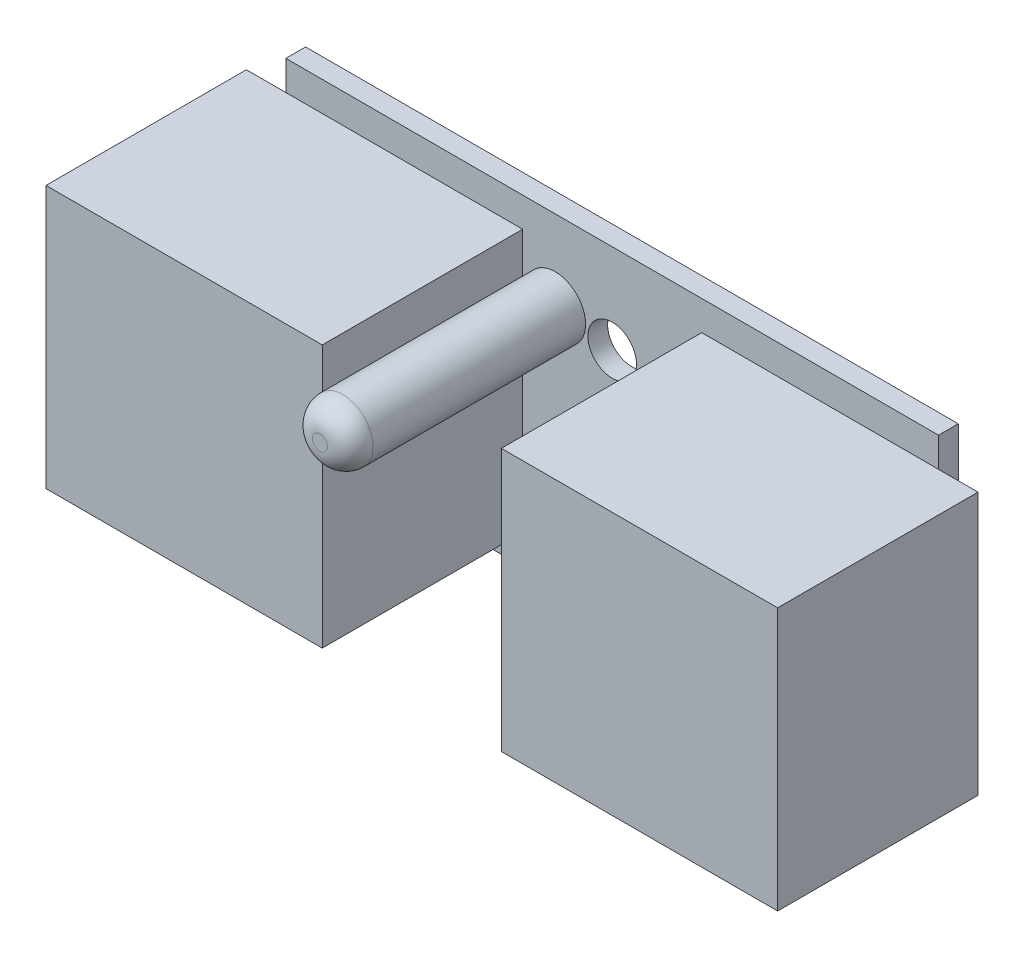
ISO-10303-21;
HEADER;
FILE_DESCRIPTION(('STEP AP214'),'2;1');
FILE_NAME('part.step','',(''),(''),'','','');
FILE_SCHEMA(('AUTOMOTIVE_DESIGN { 1 0 10303 214 1 1 1 1 }'));
ENDSEC;
DATA;
#1=APPLICATION_CONTEXT('core data for automotive mechanical design processes');
#2=APPLICATION_PROTOCOL_DEFINITION('international standard','automotive_design',2000,#1);
#3=PRODUCT_CONTEXT('',#1,'mechanical');
#4=PRODUCT('Part','Part','',(#3));
#5=PRODUCT_RELATED_PRODUCT_CATEGORY('part','',(#4));
#6=PRODUCT_DEFINITION_FORMATION('','',#4);
#7=PRODUCT_DEFINITION_CONTEXT('part definition',#1,'design');
#8=PRODUCT_DEFINITION('design','',#6,#7);
#9=PRODUCT_DEFINITION_SHAPE('','',#8);
#10=(LENGTH_UNIT() NAMED_UNIT(*) SI_UNIT(.MILLI.,.METRE.));
#11=(NAMED_UNIT(*) PLANE_ANGLE_UNIT() SI_UNIT($,.RADIAN.));
#12=(NAMED_UNIT(*) SI_UNIT($,.STERADIAN.) SOLID_ANGLE_UNIT());
#13=UNCERTAINTY_MEASURE_WITH_UNIT(LENGTH_MEASURE(1.E-05),#10,'distance_accuracy_value','');
#14=(GEOMETRIC_REPRESENTATION_CONTEXT(3) GLOBAL_UNCERTAINTY_ASSIGNED_CONTEXT((#13)) GLOBAL_UNIT_ASSIGNED_CONTEXT((#10,
#11,#12)) REPRESENTATION_CONTEXT('',''));
#15=CARTESIAN_POINT('',(0.,0.,0.));
#16=DIRECTION('',(0.,0.,1.));
#17=DIRECTION('',(1.,0.,0.));
#18=AXIS2_PLACEMENT_3D('',#15,#16,#17);
#19=CARTESIAN_POINT('',(0.,0.,1.3));
#20=DIRECTION('',(0.,0.,-1.));
#21=DIRECTION('',(-1.,0.,0.));
#22=AXIS2_PLACEMENT_3D('',#19,#20,#21);
#23=PLANE('',#22);
#24=CARTESIAN_POINT('',(17.75,15.9,1.3));
#25=DIRECTION('',(0.,0.,-1.));
#26=DIRECTION('',(-1.,0.,0.));
#27=AXIS2_PLACEMENT_3D('',#24,#25,#26);
#28=CIRCLE('',#27,2.);
#29=CARTESIAN_POINT('',(15.75,15.9,1.3));
#30=VERTEX_POINT('',#29);
#31=EDGE_CURVE('E251',#30,#30,#28,.F.);
#32=ORIENTED_EDGE('',*,*,#31,.F.);
#33=EDGE_LOOP('',(#32));
#34=FACE_BOUND('',#33,.T.);
#35=CARTESIAN_POINT('',(21.5,15.3,1.3));
#36=DIRECTION('',(0.,0.,1.));
#37=DIRECTION('',(1.,0.,0.));
#38=AXIS2_PLACEMENT_3D('',#35,#36,#37);
#39=CIRCLE('',#38,1.6);
#40=CARTESIAN_POINT('',(23.1,15.3,1.3));
#41=VERTEX_POINT('',#40);
#42=EDGE_CURVE('E212',#41,#41,#39,.T.);
#43=ORIENTED_EDGE('',*,*,#42,.F.);
#44=EDGE_LOOP('',(#43));
#45=FACE_BOUND('',#44,.T.);
#46=DIRECTION('',(1.,0.,0.));
#47=VECTOR('',#46,1.);
#48=CARTESIAN_POINT('',(-2.6,1.95,1.3));
#49=LINE('',#48,#47);
#50=CARTESIAN_POINT('',(0.,1.95,1.3));
#51=VERTEX_POINT('',#50);
#52=CARTESIAN_POINT('',(15.6,1.95,1.3));
#53=VERTEX_POINT('',#52);
#54=EDGE_CURVE('E314',#51,#53,#49,.T.);
#55=ORIENTED_EDGE('',*,*,#54,.F.);
#56=DIRECTION('',(0.,-1.,0.));
#57=VECTOR('',#56,1.);
#58=CARTESIAN_POINT('',(0.,0.,1.3));
#59=LINE('',#58,#57);
#60=CARTESIAN_POINT('',(0.,0.,1.3));
#61=VERTEX_POINT('',#60);
#62=EDGE_CURVE('E222',#51,#61,#59,.T.);
#63=ORIENTED_EDGE('',*,*,#62,.T.);
#64=DIRECTION('',(1.,0.,0.));
#65=VECTOR('',#64,1.);
#66=CARTESIAN_POINT('',(0.,0.,1.3));
#67=LINE('',#66,#65);
#68=CARTESIAN_POINT('',(43.,0.,1.3));
#69=VERTEX_POINT('',#68);
#70=EDGE_CURVE('E220',#61,#69,#67,.T.);
#71=ORIENTED_EDGE('',*,*,#70,.T.);
#72=DIRECTION('',(0.,1.,0.));
#73=VECTOR('',#72,1.);
#74=CARTESIAN_POINT('',(43.,0.,1.3));
#75=LINE('',#74,#73);
#76=CARTESIAN_POINT('',(43.,1.95,1.3));
#77=VERTEX_POINT('',#76);
#78=EDGE_CURVE('E225',#69,#77,#75,.T.);
#79=ORIENTED_EDGE('',*,*,#78,.T.);
#80=DIRECTION('',(1.,0.,0.));
#81=VECTOR('',#80,1.);
#82=CARTESIAN_POINT('',(45.6,1.95,1.3));
#83=LINE('',#82,#81);
#84=CARTESIAN_POINT('',(27.4,1.95,1.3));
#85=VERTEX_POINT('',#84);
#86=EDGE_CURVE('E184',#85,#77,#83,.T.);
#87=ORIENTED_EDGE('',*,*,#86,.F.);
#88=DIRECTION('',(0.,-1.,0.));
#89=VECTOR('',#88,1.);
#90=CARTESIAN_POINT('',(27.4,1.95,1.3));
#91=LINE('',#90,#89);
#92=CARTESIAN_POINT('',(27.4,19.25,1.3));
#93=VERTEX_POINT('',#92);
#94=EDGE_CURVE('E194',#93,#85,#91,.T.);
#95=ORIENTED_EDGE('',*,*,#94,.F.);
#96=DIRECTION('',(-1.,0.,0.));
#97=VECTOR('',#96,1.);
#98=CARTESIAN_POINT('',(45.6,19.25,1.3));
#99=LINE('',#98,#97);
#100=CARTESIAN_POINT('',(43.,19.25,1.3));
#101=VERTEX_POINT('',#100);
#102=EDGE_CURVE('E174',#101,#93,#99,.T.);
#103=ORIENTED_EDGE('',*,*,#102,.F.);
#104=CARTESIAN_POINT('',(43.,21.2,1.3));
#105=VERTEX_POINT('',#104);
#106=EDGE_CURVE('E224',#101,#105,#75,.T.);
#107=ORIENTED_EDGE('',*,*,#106,.T.);
#108=DIRECTION('',(-1.,0.,0.));
#109=VECTOR('',#108,1.);
#110=CARTESIAN_POINT('',(0.,21.2,1.3));
#111=LINE('',#110,#109);
#112=CARTESIAN_POINT('',(0.,21.2,1.3));
#113=VERTEX_POINT('',#112);
#114=EDGE_CURVE('E228',#105,#113,#111,.T.);
#115=ORIENTED_EDGE('',*,*,#114,.T.);
#116=CARTESIAN_POINT('',(0.,19.25,1.3));
#117=VERTEX_POINT('',#116);
#118=EDGE_CURVE('E218',#113,#117,#59,.T.);
#119=ORIENTED_EDGE('',*,*,#118,.T.);
#120=DIRECTION('',(-1.,0.,0.));
#121=VECTOR('',#120,1.);
#122=CARTESIAN_POINT('',(-2.6,19.25,1.3));
#123=LINE('',#122,#121);
#124=CARTESIAN_POINT('',(15.6,19.25,1.3));
#125=VERTEX_POINT('',#124);
#126=EDGE_CURVE('E65',#125,#117,#123,.T.);
#127=ORIENTED_EDGE('',*,*,#126,.F.);
#128=DIRECTION('',(0.,1.,0.));
#129=VECTOR('',#128,1.);
#130=CARTESIAN_POINT('',(15.6,19.25,1.3));
#131=LINE('',#130,#129);
#132=EDGE_CURVE('E60',#53,#125,#131,.T.);
#133=ORIENTED_EDGE('',*,*,#132,.F.);
#134=EDGE_LOOP('',(#55,#63,#71,#79,#87,#95,#103,#107,#115,#119,#127,#133));
#135=FACE_BOUND('',#134,.T.);
#136=ADVANCED_FACE('F45',(#34,#45,#135),#23,.F.);
#137=CARTESIAN_POINT('',(0.,0.,0.));
#138=DIRECTION('',(0.,0.,-1.));
#139=DIRECTION('',(-1.,0.,0.));
#140=AXIS2_PLACEMENT_3D('',#137,#138,#139);
#141=PLANE('',#140);
#142=DIRECTION('',(0.,-1.,0.));
#143=VECTOR('',#142,1.);
#144=CARTESIAN_POINT('',(0.,0.,0.));
#145=LINE('',#144,#143);
#146=CARTESIAN_POINT('',(0.,21.2,0.));
#147=VERTEX_POINT('',#146);
#148=CARTESIAN_POINT('',(0.,0.,0.));
#149=VERTEX_POINT('',#148);
#150=EDGE_CURVE('E215',#147,#149,#145,.T.);
#151=ORIENTED_EDGE('',*,*,#150,.F.);
#152=DIRECTION('',(-1.,0.,0.));
#153=VECTOR('',#152,1.);
#154=CARTESIAN_POINT('',(0.,21.2,0.));
#155=LINE('',#154,#153);
#156=CARTESIAN_POINT('',(43.,21.2,0.));
#157=VERTEX_POINT('',#156);
#158=EDGE_CURVE('E238',#157,#147,#155,.T.);
#159=ORIENTED_EDGE('',*,*,#158,.F.);
#160=DIRECTION('',(0.,1.,0.));
#161=VECTOR('',#160,1.);
#162=CARTESIAN_POINT('',(43.,0.,0.));
#163=LINE('',#162,#161);
#164=CARTESIAN_POINT('',(43.,0.,0.));
#165=VERTEX_POINT('',#164);
#166=EDGE_CURVE('E236',#165,#157,#163,.T.);
#167=ORIENTED_EDGE('',*,*,#166,.F.);
#168=DIRECTION('',(1.,0.,0.));
#169=VECTOR('',#168,1.);
#170=CARTESIAN_POINT('',(0.,0.,0.));
#171=LINE('',#170,#169);
#172=EDGE_CURVE('E234',#149,#165,#171,.T.);
#173=ORIENTED_EDGE('',*,*,#172,.F.);
#174=EDGE_LOOP('',(#151,#159,#167,#173));
#175=FACE_BOUND('',#174,.T.);
#176=CARTESIAN_POINT('',(21.5,15.3,0.));
#177=DIRECTION('',(0.,0.,1.));
#178=DIRECTION('',(1.,0.,0.));
#179=AXIS2_PLACEMENT_3D('',#176,#177,#178);
#180=CIRCLE('',#179,1.6);
#181=CARTESIAN_POINT('',(23.1,15.3,0.));
#182=VERTEX_POINT('',#181);
#183=EDGE_CURVE('E211',#182,#182,#180,.T.);
#184=ORIENTED_EDGE('',*,*,#183,.T.);
#185=EDGE_LOOP('',(#184));
#186=FACE_BOUND('',#185,.T.);
#187=ADVANCED_FACE('F272',(#175,#186),#141,.T.);
#188=CARTESIAN_POINT('',(0.,0.,1.3));
#189=DIRECTION('',(1.,0.,0.));
#190=DIRECTION('',(0.,0.,-1.));
#191=AXIS2_PLACEMENT_3D('',#188,#189,#190);
#192=PLANE('',#191);
#193=ORIENTED_EDGE('',*,*,#150,.T.);
#194=DIRECTION('',(0.,0.,-1.));
#195=VECTOR('',#194,1.);
#196=CARTESIAN_POINT('',(0.,0.,1.3));
#197=LINE('',#196,#195);
#198=EDGE_CURVE('E248',#61,#149,#197,.T.);
#199=ORIENTED_EDGE('',*,*,#198,.F.);
#200=ORIENTED_EDGE('',*,*,#62,.F.);
#201=EDGE_CURVE('E221',#117,#51,#59,.T.);
#202=ORIENTED_EDGE('',*,*,#201,.F.);
#203=ORIENTED_EDGE('',*,*,#118,.F.);
#204=DIRECTION('',(0.,0.,-1.));
#205=VECTOR('',#204,1.);
#206=CARTESIAN_POINT('',(0.,21.2,1.3));
#207=LINE('',#206,#205);
#208=EDGE_CURVE('E231',#113,#147,#207,.T.);
#209=ORIENTED_EDGE('',*,*,#208,.T.);
#210=EDGE_LOOP('',(#193,#199,#200,#202,#203,#209));
#211=FACE_BOUND('',#210,.T.);
#212=ADVANCED_FACE('F280',(#211),#192,.F.);
#213=CARTESIAN_POINT('',(0.,0.,1.3));
#214=DIRECTION('',(0.,1.,0.));
#215=DIRECTION('',(0.,0.,1.));
#216=AXIS2_PLACEMENT_3D('',#213,#214,#215);
#217=PLANE('',#216);
#218=ORIENTED_EDGE('',*,*,#172,.T.);
#219=DIRECTION('',(0.,0.,-1.));
#220=VECTOR('',#219,1.);
#221=CARTESIAN_POINT('',(43.,0.,1.3));
#222=LINE('',#221,#220);
#223=EDGE_CURVE('E245',#69,#165,#222,.T.);
#224=ORIENTED_EDGE('',*,*,#223,.F.);
#225=ORIENTED_EDGE('',*,*,#70,.F.);
#226=ORIENTED_EDGE('',*,*,#198,.T.);
#227=EDGE_LOOP('',(#218,#224,#225,#226));
#228=FACE_BOUND('',#227,.T.);
#229=ADVANCED_FACE('F296',(#228),#217,.F.);
#230=CARTESIAN_POINT('',(43.,0.,1.3));
#231=DIRECTION('',(-1.,0.,0.));
#232=DIRECTION('',(0.,0.,1.));
#233=AXIS2_PLACEMENT_3D('',#230,#231,#232);
#234=PLANE('',#233);
#235=ORIENTED_EDGE('',*,*,#166,.T.);
#236=DIRECTION('',(0.,0.,-1.));
#237=VECTOR('',#236,1.);
#238=CARTESIAN_POINT('',(43.,21.2,1.3));
#239=LINE('',#238,#237);
#240=EDGE_CURVE('E242',#105,#157,#239,.T.);
#241=ORIENTED_EDGE('',*,*,#240,.F.);
#242=ORIENTED_EDGE('',*,*,#106,.F.);
#243=EDGE_CURVE('E229',#77,#101,#75,.T.);
#244=ORIENTED_EDGE('',*,*,#243,.F.);
#245=ORIENTED_EDGE('',*,*,#78,.F.);
#246=ORIENTED_EDGE('',*,*,#223,.T.);
#247=EDGE_LOOP('',(#235,#241,#242,#244,#245,#246));
#248=FACE_BOUND('',#247,.T.);
#249=ADVANCED_FACE('F292',(#248),#234,.F.);
#250=CARTESIAN_POINT('',(0.,21.2,1.3));
#251=DIRECTION('',(0.,-1.,0.));
#252=DIRECTION('',(0.,0.,-1.));
#253=AXIS2_PLACEMENT_3D('',#250,#251,#252);
#254=PLANE('',#253);
#255=ORIENTED_EDGE('',*,*,#158,.T.);
#256=ORIENTED_EDGE('',*,*,#208,.F.);
#257=ORIENTED_EDGE('',*,*,#114,.F.);
#258=ORIENTED_EDGE('',*,*,#240,.T.);
#259=EDGE_LOOP('',(#255,#256,#257,#258));
#260=FACE_BOUND('',#259,.T.);
#261=ADVANCED_FACE('F289',(#260),#254,.F.);
#262=CARTESIAN_POINT('',(21.5,15.3,1.3));
#263=DIRECTION('',(0.,0.,-1.));
#264=DIRECTION('',(-1.,0.,0.));
#265=AXIS2_PLACEMENT_3D('',#262,#263,#264);
#266=CYLINDRICAL_SURFACE('',#265,1.6);
#267=ORIENTED_EDGE('',*,*,#42,.T.);
#268=EDGE_LOOP('',(#267));
#269=FACE_BOUND('',#268,.T.);
#270=ORIENTED_EDGE('',*,*,#183,.F.);
#271=EDGE_LOOP('',(#270));
#272=FACE_BOUND('',#271,.T.);
#273=ADVANCED_FACE('F286',(#269,#272),#266,.F.);
#274=CARTESIAN_POINT('',(17.75,15.9,16.8));
#275=DIRECTION('',(0.,0.,-1.));
#276=DIRECTION('',(-1.,0.,0.));
#277=AXIS2_PLACEMENT_3D('',#274,#275,#276);
#278=CYLINDRICAL_SURFACE('',#277,2.);
#279=CARTESIAN_POINT('',(17.75,15.9,15.3));
#280=DIRECTION('',(0.,0.,1.));
#281=DIRECTION('',(1.,0.,0.));
#282=AXIS2_PLACEMENT_3D('',#279,#280,#281);
#283=CIRCLE('',#282,2.);
#284=CARTESIAN_POINT('',(19.75,15.9,15.3));
#285=VERTEX_POINT('',#284);
#286=EDGE_CURVE('E11',#285,#285,#283,.F.);
#287=ORIENTED_EDGE('',*,*,#286,.T.);
#288=EDGE_LOOP('',(#287));
#289=FACE_BOUND('',#288,.T.);
#290=ORIENTED_EDGE('',*,*,#31,.T.);
#291=EDGE_LOOP('',(#290));
#292=FACE_BOUND('',#291,.T.);
#293=ADVANCED_FACE('F268',(#289,#292),#278,.T.);
#294=CARTESIAN_POINT('',(17.75,15.9,16.8));
#295=DIRECTION('',(0.,0.,1.));
#296=DIRECTION('',(1.,0.,0.));
#297=AXIS2_PLACEMENT_3D('',#294,#295,#296);
#298=PLANE('',#297);
#299=CARTESIAN_POINT('',(17.75,15.9,16.8));
#300=DIRECTION('',(0.,0.,1.));
#301=DIRECTION('',(1.,0.,0.));
#302=AXIS2_PLACEMENT_3D('',#299,#300,#301);
#303=CIRCLE('',#302,0.499999999999999);
#304=CARTESIAN_POINT('',(18.25,15.9,16.8));
#305=VERTEX_POINT('',#304);
#306=EDGE_CURVE('E53',#305,#305,#303,.T.);
#307=ORIENTED_EDGE('',*,*,#306,.T.);
#308=EDGE_LOOP('',(#307));
#309=FACE_BOUND('',#308,.T.);
#310=ADVANCED_FACE('F256',(#309),#298,.T.);
#311=CARTESIAN_POINT('',(17.75,15.9,15.3));
#312=DIRECTION('',(0.,0.,1.));
#313=DIRECTION('',(1.,0.,0.));
#314=AXIS2_PLACEMENT_3D('',#311,#312,#313);
#315=DEGENERATE_TOROIDAL_SURFACE('',#314,0.499999999999999,1.5,.T.);
#316=ORIENTED_EDGE('',*,*,#286,.F.);
#317=EDGE_LOOP('',(#316));
#318=FACE_BOUND('',#317,.T.);
#319=ORIENTED_EDGE('',*,*,#306,.F.);
#320=EDGE_LOOP('',(#319));
#321=FACE_BOUND('',#320,.T.);
#322=ADVANCED_FACE('F47',(#318,#321),#315,.T.);
#323=CARTESIAN_POINT('',(0.,0.,1.3));
#324=DIRECTION('',(0.,0.,1.));
#325=DIRECTION('',(1.,0.,0.));
#326=AXIS2_PLACEMENT_3D('',#323,#324,#325);
#327=PLANE('',#326);
#328=CARTESIAN_POINT('',(45.6,1.95,1.3));
#329=VERTEX_POINT('',#328);
#330=EDGE_CURVE('E197',#77,#329,#83,.T.);
#331=ORIENTED_EDGE('',*,*,#330,.F.);
#332=ORIENTED_EDGE('',*,*,#243,.T.);
#333=CARTESIAN_POINT('',(45.6,19.25,1.3));
#334=VERTEX_POINT('',#333);
#335=EDGE_CURVE('E191',#334,#101,#99,.T.);
#336=ORIENTED_EDGE('',*,*,#335,.F.);
#337=DIRECTION('',(0.,1.,0.));
#338=VECTOR('',#337,1.);
#339=CARTESIAN_POINT('',(45.6,1.95,1.3));
#340=LINE('',#339,#338);
#341=EDGE_CURVE('E171',#329,#334,#340,.T.);
#342=ORIENTED_EDGE('',*,*,#341,.F.);
#343=EDGE_LOOP('',(#331,#332,#336,#342));
#344=FACE_BOUND('',#343,.T.);
#345=ADVANCED_FACE('F259',(#344),#327,.F.);
#346=CARTESIAN_POINT('',(45.6,1.95,14.5));
#347=DIRECTION('',(-1.,0.,0.));
#348=DIRECTION('',(0.,0.,1.));
#349=AXIS2_PLACEMENT_3D('',#346,#347,#348);
#350=PLANE('',#349);
#351=ORIENTED_EDGE('',*,*,#341,.T.);
#352=DIRECTION('',(0.,0.,-1.));
#353=VECTOR('',#352,1.);
#354=CARTESIAN_POINT('',(45.6,19.25,14.5));
#355=LINE('',#354,#353);
#356=CARTESIAN_POINT('',(45.6,19.25,14.5));
#357=VERTEX_POINT('',#356);
#358=EDGE_CURVE('E208',#357,#334,#355,.T.);
#359=ORIENTED_EDGE('',*,*,#358,.F.);
#360=DIRECTION('',(0.,1.,0.));
#361=VECTOR('',#360,1.);
#362=CARTESIAN_POINT('',(45.6,1.95,14.5));
#363=LINE('',#362,#361);
#364=CARTESIAN_POINT('',(45.6,1.95,14.5));
#365=VERTEX_POINT('',#364);
#366=EDGE_CURVE('E180',#365,#357,#363,.T.);
#367=ORIENTED_EDGE('',*,*,#366,.F.);
#368=DIRECTION('',(0.,0.,-1.));
#369=VECTOR('',#368,1.);
#370=CARTESIAN_POINT('',(45.6,1.95,14.5));
#371=LINE('',#370,#369);
#372=EDGE_CURVE('E189',#365,#329,#371,.T.);
#373=ORIENTED_EDGE('',*,*,#372,.T.);
#374=EDGE_LOOP('',(#351,#359,#367,#373));
#375=FACE_BOUND('',#374,.T.);
#376=ADVANCED_FACE('F265',(#375),#350,.F.);
#377=CARTESIAN_POINT('',(45.6,19.25,14.5));
#378=DIRECTION('',(0.,-1.,0.));
#379=DIRECTION('',(1.,0.,0.));
#380=AXIS2_PLACEMENT_3D('',#377,#378,#379);
#381=PLANE('',#380);
#382=ORIENTED_EDGE('',*,*,#335,.T.);
#383=ORIENTED_EDGE('',*,*,#102,.T.);
#384=DIRECTION('',(0.,0.,-1.));
#385=VECTOR('',#384,1.);
#386=CARTESIAN_POINT('',(27.4,19.25,14.5));
#387=LINE('',#386,#385);
#388=CARTESIAN_POINT('',(27.4,19.25,14.5));
#389=VERTEX_POINT('',#388);
#390=EDGE_CURVE('E205',#389,#93,#387,.T.);
#391=ORIENTED_EDGE('',*,*,#390,.F.);
#392=DIRECTION('',(-1.,0.,0.));
#393=VECTOR('',#392,1.);
#394=CARTESIAN_POINT('',(45.6,19.25,14.5));
#395=LINE('',#394,#393);
#396=EDGE_CURVE('E183',#357,#389,#395,.T.);
#397=ORIENTED_EDGE('',*,*,#396,.F.);
#398=ORIENTED_EDGE('',*,*,#358,.T.);
#399=EDGE_LOOP('',(#382,#383,#391,#397,#398));
#400=FACE_BOUND('',#399,.T.);
#401=ADVANCED_FACE('F358',(#400),#381,.F.);
#402=CARTESIAN_POINT('',(27.4,1.95,14.5));
#403=DIRECTION('',(1.,0.,0.));
#404=DIRECTION('',(0.,0.,-1.));
#405=AXIS2_PLACEMENT_3D('',#402,#403,#404);
#406=PLANE('',#405);
#407=ORIENTED_EDGE('',*,*,#94,.T.);
#408=DIRECTION('',(0.,0.,-1.));
#409=VECTOR('',#408,1.);
#410=CARTESIAN_POINT('',(27.4,1.95,14.5));
#411=LINE('',#410,#409);
#412=CARTESIAN_POINT('',(27.4,1.95,14.5));
#413=VERTEX_POINT('',#412);
#414=EDGE_CURVE('E202',#413,#85,#411,.T.);
#415=ORIENTED_EDGE('',*,*,#414,.F.);
#416=DIRECTION('',(0.,-1.,0.));
#417=VECTOR('',#416,1.);
#418=CARTESIAN_POINT('',(27.4,1.95,14.5));
#419=LINE('',#418,#417);
#420=EDGE_CURVE('E186',#389,#413,#419,.T.);
#421=ORIENTED_EDGE('',*,*,#420,.F.);
#422=ORIENTED_EDGE('',*,*,#390,.T.);
#423=EDGE_LOOP('',(#407,#415,#421,#422));
#424=FACE_BOUND('',#423,.T.);
#425=ADVANCED_FACE('F354',(#424),#406,.F.);
#426=CARTESIAN_POINT('',(45.6,1.95,14.5));
#427=DIRECTION('',(0.,1.,0.));
#428=DIRECTION('',(-1.,0.,0.));
#429=AXIS2_PLACEMENT_3D('',#426,#427,#428);
#430=PLANE('',#429);
#431=ORIENTED_EDGE('',*,*,#86,.T.);
#432=ORIENTED_EDGE('',*,*,#330,.T.);
#433=ORIENTED_EDGE('',*,*,#372,.F.);
#434=DIRECTION('',(1.,0.,0.));
#435=VECTOR('',#434,1.);
#436=CARTESIAN_POINT('',(45.6,1.95,14.5));
#437=LINE('',#436,#435);
#438=EDGE_CURVE('E188',#413,#365,#437,.T.);
#439=ORIENTED_EDGE('',*,*,#438,.F.);
#440=ORIENTED_EDGE('',*,*,#414,.T.);
#441=EDGE_LOOP('',(#431,#432,#433,#439,#440));
#442=FACE_BOUND('',#441,.T.);
#443=ADVANCED_FACE('F349',(#442),#430,.F.);
#444=CARTESIAN_POINT('',(0.,0.,14.5));
#445=DIRECTION('',(0.,0.,1.));
#446=DIRECTION('',(1.,0.,0.));
#447=AXIS2_PLACEMENT_3D('',#444,#445,#446);
#448=PLANE('',#447);
#449=ORIENTED_EDGE('',*,*,#366,.T.);
#450=ORIENTED_EDGE('',*,*,#396,.T.);
#451=ORIENTED_EDGE('',*,*,#420,.T.);
#452=ORIENTED_EDGE('',*,*,#438,.T.);
#453=EDGE_LOOP('',(#449,#450,#451,#452));
#454=FACE_BOUND('',#453,.T.);
#455=ADVANCED_FACE('F347',(#454),#448,.T.);
#456=CARTESIAN_POINT('',(0.,0.,1.3));
#457=DIRECTION('',(0.,0.,1.));
#458=DIRECTION('',(1.,0.,0.));
#459=AXIS2_PLACEMENT_3D('',#456,#457,#458);
#460=PLANE('',#459);
#461=CARTESIAN_POINT('',(-2.6,19.25,1.3));
#462=VERTEX_POINT('',#461);
#463=EDGE_CURVE('E320',#117,#462,#123,.T.);
#464=ORIENTED_EDGE('',*,*,#463,.F.);
#465=ORIENTED_EDGE('',*,*,#201,.T.);
#466=CARTESIAN_POINT('',(-2.6,1.95,1.3));
#467=VERTEX_POINT('',#466);
#468=EDGE_CURVE('E319',#467,#51,#49,.T.);
#469=ORIENTED_EDGE('',*,*,#468,.F.);
#470=DIRECTION('',(0.,-1.,0.));
#471=VECTOR('',#470,1.);
#472=CARTESIAN_POINT('',(-2.6,19.25,1.3));
#473=LINE('',#472,#471);
#474=EDGE_CURVE('E170',#462,#467,#473,.T.);
#475=ORIENTED_EDGE('',*,*,#474,.F.);
#476=EDGE_LOOP('',(#464,#465,#469,#475));
#477=FACE_BOUND('',#476,.T.);
#478=ADVANCED_FACE('F318',(#477),#460,.F.);
#479=CARTESIAN_POINT('',(-2.6,19.25,14.5));
#480=DIRECTION('',(1.,0.,0.));
#481=DIRECTION('',(0.,1.,0.));
#482=AXIS2_PLACEMENT_3D('',#479,#480,#481);
#483=PLANE('',#482);
#484=ORIENTED_EDGE('',*,*,#474,.T.);
#485=DIRECTION('',(0.,0.,-1.));
#486=VECTOR('',#485,1.);
#487=CARTESIAN_POINT('',(-2.6,1.95,14.5));
#488=LINE('',#487,#486);
#489=CARTESIAN_POINT('',(-2.6,1.95,14.5));
#490=VERTEX_POINT('',#489);
#491=EDGE_CURVE('E151',#490,#467,#488,.T.);
#492=ORIENTED_EDGE('',*,*,#491,.F.);
#493=DIRECTION('',(0.,-1.,0.));
#494=VECTOR('',#493,1.);
#495=CARTESIAN_POINT('',(-2.6,19.25,14.5));
#496=LINE('',#495,#494);
#497=CARTESIAN_POINT('',(-2.6,19.25,14.5));
#498=VERTEX_POINT('',#497);
#499=EDGE_CURVE('E158',#498,#490,#496,.T.);
#500=ORIENTED_EDGE('',*,*,#499,.F.);
#501=DIRECTION('',(0.,0.,-1.));
#502=VECTOR('',#501,1.);
#503=CARTESIAN_POINT('',(-2.6,19.25,14.5));
#504=LINE('',#503,#502);
#505=EDGE_CURVE('E327',#498,#462,#504,.T.);
#506=ORIENTED_EDGE('',*,*,#505,.T.);
#507=EDGE_LOOP('',(#484,#492,#500,#506));
#508=FACE_BOUND('',#507,.T.);
#509=ADVANCED_FACE('F168',(#508),#483,.F.);
#510=CARTESIAN_POINT('',(-2.6,1.95,14.5));
#511=DIRECTION('',(0.,1.,0.));
#512=DIRECTION('',(0.,0.,1.));
#513=AXIS2_PLACEMENT_3D('',#510,#511,#512);
#514=PLANE('',#513);
#515=ORIENTED_EDGE('',*,*,#468,.T.);
#516=ORIENTED_EDGE('',*,*,#54,.T.);
#517=DIRECTION('',(0.,0.,-1.));
#518=VECTOR('',#517,1.);
#519=CARTESIAN_POINT('',(15.6,1.95,14.5));
#520=LINE('',#519,#518);
#521=CARTESIAN_POINT('',(15.6,1.95,14.5));
#522=VERTEX_POINT('',#521);
#523=EDGE_CURVE('E154',#522,#53,#520,.T.);
#524=ORIENTED_EDGE('',*,*,#523,.F.);
#525=DIRECTION('',(1.,0.,0.));
#526=VECTOR('',#525,1.);
#527=CARTESIAN_POINT('',(-2.6,1.95,14.5));
#528=LINE('',#527,#526);
#529=EDGE_CURVE('E146',#490,#522,#528,.T.);
#530=ORIENTED_EDGE('',*,*,#529,.F.);
#531=ORIENTED_EDGE('',*,*,#491,.T.);
#532=EDGE_LOOP('',(#515,#516,#524,#530,#531));
#533=FACE_BOUND('',#532,.T.);
#534=ADVANCED_FACE('F149',(#533),#514,.F.);
#535=CARTESIAN_POINT('',(15.6,19.25,14.5));
#536=DIRECTION('',(-1.,0.,0.));
#537=DIRECTION('',(0.,-1.,0.));
#538=AXIS2_PLACEMENT_3D('',#535,#536,#537);
#539=PLANE('',#538);
#540=ORIENTED_EDGE('',*,*,#132,.T.);
#541=DIRECTION('',(0.,0.,-1.));
#542=VECTOR('',#541,1.);
#543=CARTESIAN_POINT('',(15.6,19.25,14.5));
#544=LINE('',#543,#542);
#545=CARTESIAN_POINT('',(15.6,19.25,14.5));
#546=VERTEX_POINT('',#545);
#547=EDGE_CURVE('E176',#546,#125,#544,.T.);
#548=ORIENTED_EDGE('',*,*,#547,.F.);
#549=DIRECTION('',(0.,1.,0.));
#550=VECTOR('',#549,1.);
#551=CARTESIAN_POINT('',(15.6,19.25,14.5));
#552=LINE('',#551,#550);
#553=EDGE_CURVE('E157',#522,#546,#552,.T.);
#554=ORIENTED_EDGE('',*,*,#553,.F.);
#555=ORIENTED_EDGE('',*,*,#523,.T.);
#556=EDGE_LOOP('',(#540,#548,#554,#555));
#557=FACE_BOUND('',#556,.T.);
#558=ADVANCED_FACE('F333',(#557),#539,.F.);
#559=CARTESIAN_POINT('',(-2.6,19.25,14.5));
#560=DIRECTION('',(0.,-1.,0.));
#561=DIRECTION('',(1.,0.,0.));
#562=AXIS2_PLACEMENT_3D('',#559,#560,#561);
#563=PLANE('',#562);
#564=ORIENTED_EDGE('',*,*,#126,.T.);
#565=ORIENTED_EDGE('',*,*,#463,.T.);
#566=ORIENTED_EDGE('',*,*,#505,.F.);
#567=DIRECTION('',(-1.,0.,0.));
#568=VECTOR('',#567,1.);
#569=CARTESIAN_POINT('',(-2.6,19.25,14.5));
#570=LINE('',#569,#568);
#571=EDGE_CURVE('E163',#546,#498,#570,.T.);
#572=ORIENTED_EDGE('',*,*,#571,.F.);
#573=ORIENTED_EDGE('',*,*,#547,.T.);
#574=EDGE_LOOP('',(#564,#565,#566,#572,#573));
#575=FACE_BOUND('',#574,.T.);
#576=ADVANCED_FACE('F331',(#575),#563,.F.);
#577=CARTESIAN_POINT('',(0.,0.,14.5));
#578=DIRECTION('',(0.,0.,1.));
#579=DIRECTION('',(1.,0.,0.));
#580=AXIS2_PLACEMENT_3D('',#577,#578,#579);
#581=PLANE('',#580);
#582=ORIENTED_EDGE('',*,*,#499,.T.);
#583=ORIENTED_EDGE('',*,*,#529,.T.);
#584=ORIENTED_EDGE('',*,*,#553,.T.);
#585=ORIENTED_EDGE('',*,*,#571,.T.);
#586=EDGE_LOOP('',(#582,#583,#584,#585));
#587=FACE_BOUND('',#586,.T.);
#588=ADVANCED_FACE('F161',(#587),#581,.T.);
#589=CLOSED_SHELL('',(#136,#187,#212,#229,#249,#261,#273,#293,#310,#322,#345,#376,#401,#425,
#443,#455,#478,#509,#534,#558,#576,#588));
#590=MANIFOLD_SOLID_BREP('B2',#589);
#591=ADVANCED_BREP_SHAPE_REPRESENTATION('',(#18,#590),#14);
#592=SHAPE_DEFINITION_REPRESENTATION(#9,#591);
ENDSEC;
END-ISO-10303-21;
